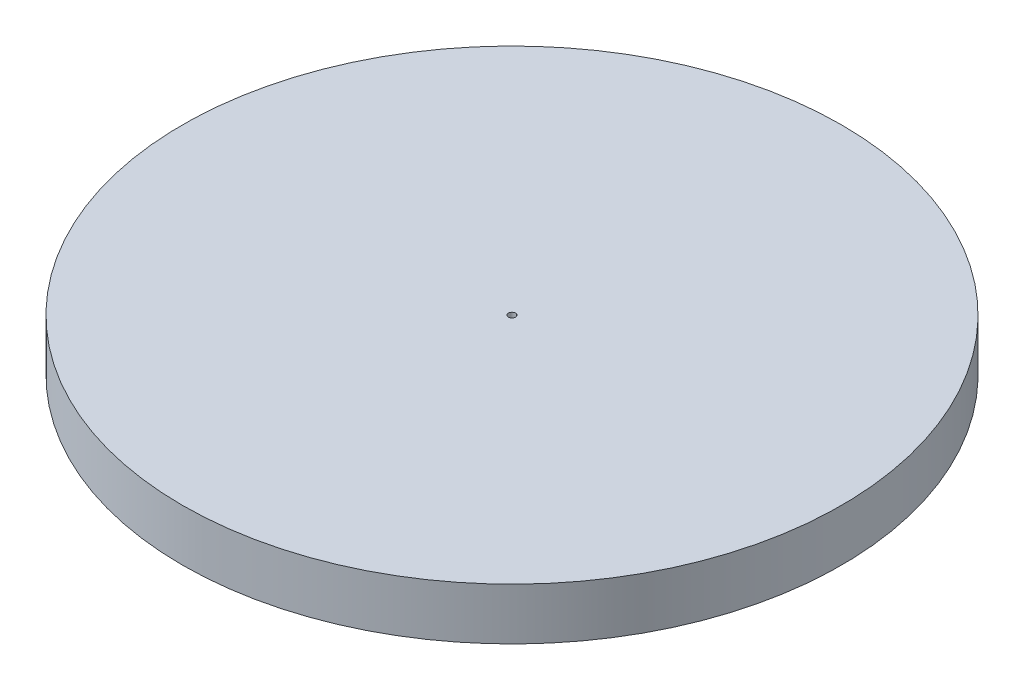
ISO-10303-21;
HEADER;
FILE_DESCRIPTION(('STEP AP214'),'2;1');
FILE_NAME('part.step','',(''),(''),'','','');
FILE_SCHEMA(('AUTOMOTIVE_DESIGN { 1 0 10303 214 1 1 1 1 }'));
ENDSEC;
DATA;
#1=APPLICATION_CONTEXT('core data for automotive mechanical design processes');
#2=APPLICATION_PROTOCOL_DEFINITION('international standard','automotive_design',2000,#1);
#3=PRODUCT_CONTEXT('',#1,'mechanical');
#4=PRODUCT('Part','Part','',(#3));
#5=PRODUCT_RELATED_PRODUCT_CATEGORY('part','',(#4));
#6=PRODUCT_DEFINITION_FORMATION('','',#4);
#7=PRODUCT_DEFINITION_CONTEXT('part definition',#1,'design');
#8=PRODUCT_DEFINITION('design','',#6,#7);
#9=PRODUCT_DEFINITION_SHAPE('','',#8);
#10=(LENGTH_UNIT() NAMED_UNIT(*) SI_UNIT(.MILLI.,.METRE.));
#11=(NAMED_UNIT(*) PLANE_ANGLE_UNIT() SI_UNIT($,.RADIAN.));
#12=(NAMED_UNIT(*) SI_UNIT($,.STERADIAN.) SOLID_ANGLE_UNIT());
#13=UNCERTAINTY_MEASURE_WITH_UNIT(LENGTH_MEASURE(1.E-05),#10,'distance_accuracy_value','');
#14=(GEOMETRIC_REPRESENTATION_CONTEXT(3) GLOBAL_UNCERTAINTY_ASSIGNED_CONTEXT((#13)) GLOBAL_UNIT_ASSIGNED_CONTEXT((#10,
#11,#12)) REPRESENTATION_CONTEXT('',''));
#15=CARTESIAN_POINT('',(0.,0.,0.));
#16=DIRECTION('',(0.,0.,1.));
#17=DIRECTION('',(1.,0.,0.));
#18=AXIS2_PLACEMENT_3D('',#15,#16,#17);
#19=CARTESIAN_POINT('',(0.,11.,0.));
#20=DIRECTION('',(0.,-1.,0.));
#21=DIRECTION('',(0.,0.,-1.));
#22=AXIS2_PLACEMENT_3D('',#19,#20,#21);
#23=CYLINDRICAL_SURFACE('',#22,70.);
#24=CARTESIAN_POINT('',(0.,11.,0.));
#25=DIRECTION('',(0.,1.,0.));
#26=DIRECTION('',(0.,0.,1.));
#27=AXIS2_PLACEMENT_3D('',#24,#25,#26);
#28=CIRCLE('',#27,70.);
#29=CARTESIAN_POINT('',(0.,11.,70.));
#30=VERTEX_POINT('',#29);
#31=EDGE_CURVE('E10',#30,#30,#28,.T.);
#32=ORIENTED_EDGE('',*,*,#31,.F.);
#33=EDGE_LOOP('',(#32));
#34=FACE_BOUND('',#33,.T.);
#35=CARTESIAN_POINT('',(0.,0.,0.));
#36=DIRECTION('',(0.,1.,0.));
#37=DIRECTION('',(0.,0.,1.));
#38=AXIS2_PLACEMENT_3D('',#35,#36,#37);
#39=CIRCLE('',#38,70.);
#40=CARTESIAN_POINT('',(0.,0.,70.));
#41=VERTEX_POINT('',#40);
#42=EDGE_CURVE('E34',#41,#41,#39,.T.);
#43=ORIENTED_EDGE('',*,*,#42,.T.);
#44=EDGE_LOOP('',(#43));
#45=FACE_BOUND('',#44,.T.);
#46=ADVANCED_FACE('F31',(#34,#45),#23,.T.);
#47=CARTESIAN_POINT('',(0.,11.,0.));
#48=DIRECTION('',(0.,1.,0.));
#49=DIRECTION('',(0.,0.,1.));
#50=AXIS2_PLACEMENT_3D('',#47,#48,#49);
#51=PLANE('',#50);
#52=CARTESIAN_POINT('',(0.,11.,0.));
#53=DIRECTION('',(0.,1.,0.));
#54=DIRECTION('',(0.,0.,1.));
#55=AXIS2_PLACEMENT_3D('',#52,#53,#54);
#56=CIRCLE('',#55,0.75);
#57=CARTESIAN_POINT('',(0.,11.,0.75));
#58=VERTEX_POINT('',#57);
#59=EDGE_CURVE('E45',#58,#58,#56,.T.);
#60=ORIENTED_EDGE('',*,*,#59,.F.);
#61=EDGE_LOOP('',(#60));
#62=FACE_BOUND('',#61,.T.);
#63=ORIENTED_EDGE('',*,*,#31,.T.);
#64=EDGE_LOOP('',(#63));
#65=FACE_BOUND('',#64,.T.);
#66=ADVANCED_FACE('F52',(#62,#65),#51,.T.);
#67=CARTESIAN_POINT('',(0.,0.,0.));
#68=DIRECTION('',(0.,1.,0.));
#69=DIRECTION('',(0.,0.,1.));
#70=AXIS2_PLACEMENT_3D('',#67,#68,#69);
#71=PLANE('',#70);
#72=CARTESIAN_POINT('',(0.,0.,0.));
#73=DIRECTION('',(0.,1.,0.));
#74=DIRECTION('',(0.,0.,1.));
#75=AXIS2_PLACEMENT_3D('',#72,#73,#74);
#76=CIRCLE('',#75,0.75);
#77=CARTESIAN_POINT('',(0.,0.,0.75));
#78=VERTEX_POINT('',#77);
#79=EDGE_CURVE('E41',#78,#78,#76,.F.);
#80=ORIENTED_EDGE('',*,*,#79,.F.);
#81=EDGE_LOOP('',(#80));
#82=FACE_BOUND('',#81,.T.);
#83=ORIENTED_EDGE('',*,*,#42,.F.);
#84=EDGE_LOOP('',(#83));
#85=FACE_BOUND('',#84,.T.);
#86=ADVANCED_FACE('F54',(#82,#85),#71,.F.);
#87=CARTESIAN_POINT('',(0.,-0.000999999999999265,0.));
#88=DIRECTION('',(0.,1.,0.));
#89=DIRECTION('',(0.,0.,1.));
#90=AXIS2_PLACEMENT_3D('',#87,#88,#89);
#91=CYLINDRICAL_SURFACE('',#90,0.75);
#92=ORIENTED_EDGE('',*,*,#59,.T.);
#93=EDGE_LOOP('',(#92));
#94=FACE_BOUND('',#93,.T.);
#95=ORIENTED_EDGE('',*,*,#79,.T.);
#96=EDGE_LOOP('',(#95));
#97=FACE_BOUND('',#96,.T.);
#98=ADVANCED_FACE('F49',(#94,#97),#91,.F.);
#99=CLOSED_SHELL('',(#46,#66,#86,#98));
#100=MANIFOLD_SOLID_BREP('B2',#99);
#101=ADVANCED_BREP_SHAPE_REPRESENTATION('',(#18,#100),#14);
#102=SHAPE_DEFINITION_REPRESENTATION(#9,#101);
ENDSEC;
END-ISO-10303-21;
